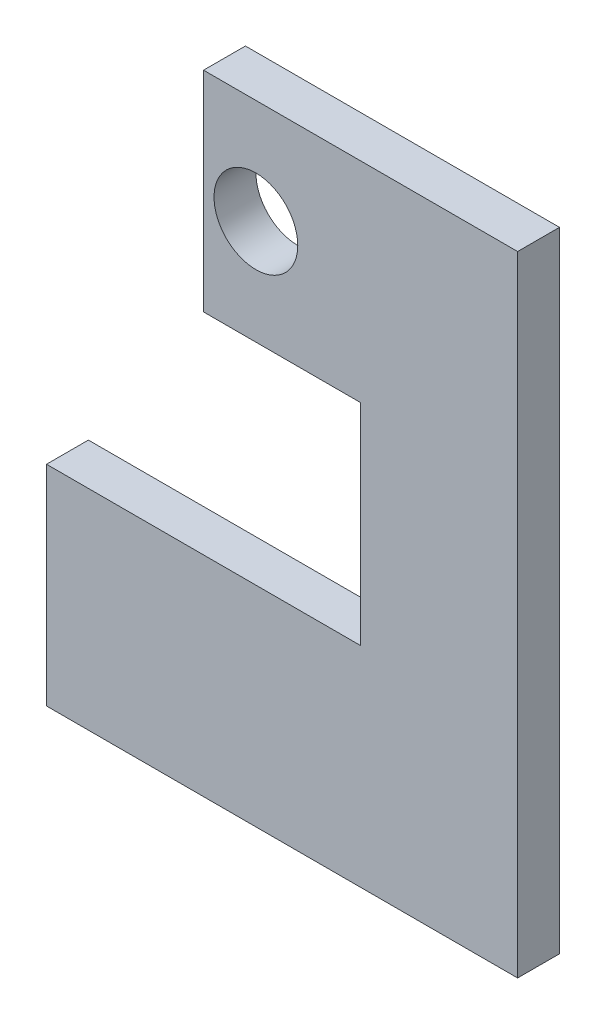
ISO-10303-21;
HEADER;
FILE_DESCRIPTION(('STEP AP214'),'2;1');
FILE_NAME('part.step','',(''),(''),'','','');
FILE_SCHEMA(('AUTOMOTIVE_DESIGN { 1 0 10303 214 1 1 1 1 }'));
ENDSEC;
DATA;
#1=APPLICATION_CONTEXT('core data for automotive mechanical design processes');
#2=APPLICATION_PROTOCOL_DEFINITION('international standard','automotive_design',2000,#1);
#3=PRODUCT_CONTEXT('',#1,'mechanical');
#4=PRODUCT('Part','Part','',(#3));
#5=PRODUCT_RELATED_PRODUCT_CATEGORY('part','',(#4));
#6=PRODUCT_DEFINITION_FORMATION('','',#4);
#7=PRODUCT_DEFINITION_CONTEXT('part definition',#1,'design');
#8=PRODUCT_DEFINITION('design','',#6,#7);
#9=PRODUCT_DEFINITION_SHAPE('','',#8);
#10=(LENGTH_UNIT() NAMED_UNIT(*) SI_UNIT(.MILLI.,.METRE.));
#11=(NAMED_UNIT(*) PLANE_ANGLE_UNIT() SI_UNIT($,.RADIAN.));
#12=(NAMED_UNIT(*) SI_UNIT($,.STERADIAN.) SOLID_ANGLE_UNIT());
#13=UNCERTAINTY_MEASURE_WITH_UNIT(LENGTH_MEASURE(1.E-05),#10,'distance_accuracy_value','');
#14=(GEOMETRIC_REPRESENTATION_CONTEXT(3) GLOBAL_UNCERTAINTY_ASSIGNED_CONTEXT((#13)) GLOBAL_UNIT_ASSIGNED_CONTEXT((#10,
#11,#12)) REPRESENTATION_CONTEXT('',''));
#15=CARTESIAN_POINT('',(0.,0.,0.));
#16=DIRECTION('',(0.,0.,1.));
#17=DIRECTION('',(1.,0.,0.));
#18=AXIS2_PLACEMENT_3D('',#15,#16,#17);
#19=CARTESIAN_POINT('',(0.,0.,20.));
#20=DIRECTION('',(0.,0.,1.));
#21=DIRECTION('',(1.,0.,0.));
#22=AXIS2_PLACEMENT_3D('',#19,#20,#21);
#23=PLANE('',#22);
#24=DIRECTION('',(0.,-1.,0.));
#25=VECTOR('',#24,1.);
#26=CARTESIAN_POINT('',(-75.,50.,20.));
#27=LINE('',#26,#25);
#28=CARTESIAN_POINT('',(-75.,50.,20.));
#29=VERTEX_POINT('',#28);
#30=CARTESIAN_POINT('',(-75.,-50.,20.));
#31=VERTEX_POINT('',#30);
#32=EDGE_CURVE('E166',#29,#31,#27,.T.);
#33=ORIENTED_EDGE('',*,*,#32,.T.);
#34=DIRECTION('',(1.,0.,0.));
#35=VECTOR('',#34,1.);
#36=CARTESIAN_POINT('',(-75.,-50.,20.));
#37=LINE('',#36,#35);
#38=CARTESIAN_POINT('',(0.,-50.,20.));
#39=VERTEX_POINT('',#38);
#40=EDGE_CURVE('E101',#31,#39,#37,.T.);
#41=ORIENTED_EDGE('',*,*,#40,.T.);
#42=DIRECTION('',(0.,-1.,0.));
#43=VECTOR('',#42,1.);
#44=CARTESIAN_POINT('',(0.,-50.,20.));
#45=LINE('',#44,#43);
#46=CARTESIAN_POINT('',(0.,-150.488405268232,20.));
#47=VERTEX_POINT('',#46);
#48=EDGE_CURVE('E187',#39,#47,#45,.T.);
#49=ORIENTED_EDGE('',*,*,#48,.T.);
#50=DIRECTION('',(-1.,0.,0.));
#51=VECTOR('',#50,1.);
#52=CARTESIAN_POINT('',(0.,-150.488405268232,20.));
#53=LINE('',#52,#51);
#54=CARTESIAN_POINT('',(-150.,-150.488405268232,20.));
#55=VERTEX_POINT('',#54);
#56=EDGE_CURVE('E201',#47,#55,#53,.T.);
#57=ORIENTED_EDGE('',*,*,#56,.T.);
#58=DIRECTION('',(0.,-1.,0.));
#59=VECTOR('',#58,1.);
#60=CARTESIAN_POINT('',(-150.,-150.488405268232,20.));
#61=LINE('',#60,#59);
#62=CARTESIAN_POINT('',(-150.,-250.488405268232,20.));
#63=VERTEX_POINT('',#62);
#64=EDGE_CURVE('E120',#55,#63,#61,.T.);
#65=ORIENTED_EDGE('',*,*,#64,.T.);
#66=DIRECTION('',(1.,0.,0.));
#67=VECTOR('',#66,1.);
#68=CARTESIAN_POINT('',(-150.,-250.488405268232,20.));
#69=LINE('',#68,#67);
#70=CARTESIAN_POINT('',(75.,-250.488405268232,20.));
#71=VERTEX_POINT('',#70);
#72=EDGE_CURVE('E114',#63,#71,#69,.T.);
#73=ORIENTED_EDGE('',*,*,#72,.T.);
#74=DIRECTION('',(0.,1.,0.));
#75=VECTOR('',#74,1.);
#76=CARTESIAN_POINT('',(75.,-250.488405268232,20.));
#77=LINE('',#76,#75);
#78=CARTESIAN_POINT('',(75.,50.,20.));
#79=VERTEX_POINT('',#78);
#80=EDGE_CURVE('E118',#71,#79,#77,.T.);
#81=ORIENTED_EDGE('',*,*,#80,.T.);
#82=DIRECTION('',(-1.,0.,0.));
#83=VECTOR('',#82,1.);
#84=CARTESIAN_POINT('',(-75.,50.,20.));
#85=LINE('',#84,#83);
#86=EDGE_CURVE('E59',#79,#29,#85,.T.);
#87=ORIENTED_EDGE('',*,*,#86,.T.);
#88=EDGE_LOOP('',(#33,#41,#49,#57,#65,#73,#81,#87));
#89=FACE_BOUND('',#88,.T.);
#90=CARTESIAN_POINT('',(-50.,0.,20.));
#91=DIRECTION('',(0.,0.,1.));
#92=DIRECTION('',(1.,0.,0.));
#93=AXIS2_PLACEMENT_3D('',#90,#91,#92);
#94=CIRCLE('',#93,20.);
#95=CARTESIAN_POINT('',(-30.,0.,20.));
#96=VERTEX_POINT('',#95);
#97=EDGE_CURVE('E148',#96,#96,#94,.T.);
#98=ORIENTED_EDGE('',*,*,#97,.F.);
#99=EDGE_LOOP('',(#98));
#100=FACE_BOUND('',#99,.T.);
#101=ADVANCED_FACE('F41',(#89,#100),#23,.T.);
#102=CARTESIAN_POINT('',(0.,0.,0.));
#103=DIRECTION('',(0.,0.,1.));
#104=DIRECTION('',(1.,0.,0.));
#105=AXIS2_PLACEMENT_3D('',#102,#103,#104);
#106=PLANE('',#105);
#107=DIRECTION('',(0.,-1.,0.));
#108=VECTOR('',#107,1.);
#109=CARTESIAN_POINT('',(-75.,50.,0.));
#110=LINE('',#109,#108);
#111=CARTESIAN_POINT('',(-75.,50.,0.));
#112=VERTEX_POINT('',#111);
#113=CARTESIAN_POINT('',(-75.,-50.,0.));
#114=VERTEX_POINT('',#113);
#115=EDGE_CURVE('E143',#112,#114,#110,.T.);
#116=ORIENTED_EDGE('',*,*,#115,.F.);
#117=DIRECTION('',(-1.,0.,0.));
#118=VECTOR('',#117,1.);
#119=CARTESIAN_POINT('',(-75.,50.,0.));
#120=LINE('',#119,#118);
#121=CARTESIAN_POINT('',(75.,50.,0.));
#122=VERTEX_POINT('',#121);
#123=EDGE_CURVE('E93',#122,#112,#120,.T.);
#124=ORIENTED_EDGE('',*,*,#123,.F.);
#125=DIRECTION('',(0.,1.,0.));
#126=VECTOR('',#125,1.);
#127=CARTESIAN_POINT('',(75.,50.,0.));
#128=LINE('',#127,#126);
#129=CARTESIAN_POINT('',(75.,-250.488405268232,0.));
#130=VERTEX_POINT('',#129);
#131=EDGE_CURVE('E87',#130,#122,#128,.T.);
#132=ORIENTED_EDGE('',*,*,#131,.F.);
#133=DIRECTION('',(1.,0.,0.));
#134=VECTOR('',#133,1.);
#135=CARTESIAN_POINT('',(-150.,-250.488405268232,0.));
#136=LINE('',#135,#134);
#137=CARTESIAN_POINT('',(-150.,-250.488405268232,0.));
#138=VERTEX_POINT('',#137);
#139=EDGE_CURVE('E130',#138,#130,#136,.T.);
#140=ORIENTED_EDGE('',*,*,#139,.F.);
#141=DIRECTION('',(0.,-1.,0.));
#142=VECTOR('',#141,1.);
#143=CARTESIAN_POINT('',(-150.,-150.488405268232,0.));
#144=LINE('',#143,#142);
#145=CARTESIAN_POINT('',(-150.,-150.488405268232,0.));
#146=VERTEX_POINT('',#145);
#147=EDGE_CURVE('E157',#146,#138,#144,.T.);
#148=ORIENTED_EDGE('',*,*,#147,.F.);
#149=DIRECTION('',(-1.,0.,0.));
#150=VECTOR('',#149,1.);
#151=CARTESIAN_POINT('',(0.,-150.488405268232,0.));
#152=LINE('',#151,#150);
#153=CARTESIAN_POINT('',(0.,-150.488405268232,0.));
#154=VERTEX_POINT('',#153);
#155=EDGE_CURVE('E154',#154,#146,#152,.T.);
#156=ORIENTED_EDGE('',*,*,#155,.F.);
#157=DIRECTION('',(0.,-1.,0.));
#158=VECTOR('',#157,1.);
#159=CARTESIAN_POINT('',(0.,-50.,0.));
#160=LINE('',#159,#158);
#161=CARTESIAN_POINT('',(0.,-50.,0.));
#162=VERTEX_POINT('',#161);
#163=EDGE_CURVE('E151',#162,#154,#160,.T.);
#164=ORIENTED_EDGE('',*,*,#163,.F.);
#165=DIRECTION('',(1.,0.,0.));
#166=VECTOR('',#165,1.);
#167=CARTESIAN_POINT('',(-75.,-50.,0.));
#168=LINE('',#167,#166);
#169=EDGE_CURVE('E147',#114,#162,#168,.T.);
#170=ORIENTED_EDGE('',*,*,#169,.F.);
#171=EDGE_LOOP('',(#116,#124,#132,#140,#148,#156,#164,#170));
#172=FACE_BOUND('',#171,.T.);
#173=CARTESIAN_POINT('',(-50.,0.,0.));
#174=DIRECTION('',(0.,0.,1.));
#175=DIRECTION('',(1.,0.,0.));
#176=AXIS2_PLACEMENT_3D('',#173,#174,#175);
#177=CIRCLE('',#176,20.);
#178=CARTESIAN_POINT('',(-30.,0.,0.));
#179=VERTEX_POINT('',#178);
#180=EDGE_CURVE('E211',#179,#179,#177,.T.);
#181=ORIENTED_EDGE('',*,*,#180,.T.);
#182=EDGE_LOOP('',(#181));
#183=FACE_BOUND('',#182,.T.);
#184=ADVANCED_FACE('F191',(#172,#183),#106,.F.);
#185=CARTESIAN_POINT('',(-75.,50.,20.));
#186=DIRECTION('',(1.,0.,0.));
#187=DIRECTION('',(0.,0.,-1.));
#188=AXIS2_PLACEMENT_3D('',#185,#186,#187);
#189=PLANE('',#188);
#190=ORIENTED_EDGE('',*,*,#115,.T.);
#191=DIRECTION('',(0.,0.,-1.));
#192=VECTOR('',#191,1.);
#193=CARTESIAN_POINT('',(-75.,-50.,20.));
#194=LINE('',#193,#192);
#195=EDGE_CURVE('E11',#31,#114,#194,.T.);
#196=ORIENTED_EDGE('',*,*,#195,.F.);
#197=ORIENTED_EDGE('',*,*,#32,.F.);
#198=DIRECTION('',(0.,0.,-1.));
#199=VECTOR('',#198,1.);
#200=CARTESIAN_POINT('',(-75.,50.,20.));
#201=LINE('',#200,#199);
#202=EDGE_CURVE('E139',#29,#112,#201,.T.);
#203=ORIENTED_EDGE('',*,*,#202,.T.);
#204=EDGE_LOOP('',(#190,#196,#197,#203));
#205=FACE_BOUND('',#204,.T.);
#206=ADVANCED_FACE('F43',(#205),#189,.F.);
#207=CARTESIAN_POINT('',(-75.,-50.,20.));
#208=DIRECTION('',(0.,1.,0.));
#209=DIRECTION('',(0.,0.,1.));
#210=AXIS2_PLACEMENT_3D('',#207,#208,#209);
#211=PLANE('',#210);
#212=ORIENTED_EDGE('',*,*,#169,.T.);
#213=DIRECTION('',(0.,0.,-1.));
#214=VECTOR('',#213,1.);
#215=CARTESIAN_POINT('',(0.,-50.,20.));
#216=LINE('',#215,#214);
#217=EDGE_CURVE('E51',#39,#162,#216,.T.);
#218=ORIENTED_EDGE('',*,*,#217,.F.);
#219=ORIENTED_EDGE('',*,*,#40,.F.);
#220=ORIENTED_EDGE('',*,*,#195,.T.);
#221=EDGE_LOOP('',(#212,#218,#219,#220));
#222=FACE_BOUND('',#221,.T.);
#223=ADVANCED_FACE('F241',(#222),#211,.F.);
#224=CARTESIAN_POINT('',(0.,-50.,20.));
#225=DIRECTION('',(1.,0.,0.));
#226=DIRECTION('',(0.,1.,0.));
#227=AXIS2_PLACEMENT_3D('',#224,#225,#226);
#228=PLANE('',#227);
#229=ORIENTED_EDGE('',*,*,#163,.T.);
#230=DIRECTION('',(0.,0.,-1.));
#231=VECTOR('',#230,1.);
#232=CARTESIAN_POINT('',(0.,-150.488405268232,20.));
#233=LINE('',#232,#231);
#234=EDGE_CURVE('E177',#47,#154,#233,.T.);
#235=ORIENTED_EDGE('',*,*,#234,.F.);
#236=ORIENTED_EDGE('',*,*,#48,.F.);
#237=ORIENTED_EDGE('',*,*,#217,.T.);
#238=EDGE_LOOP('',(#229,#235,#236,#237));
#239=FACE_BOUND('',#238,.T.);
#240=ADVANCED_FACE('F185',(#239),#228,.F.);
#241=CARTESIAN_POINT('',(0.,-150.488405268232,20.));
#242=DIRECTION('',(0.,-1.,0.));
#243=DIRECTION('',(1.,0.,0.));
#244=AXIS2_PLACEMENT_3D('',#241,#242,#243);
#245=PLANE('',#244);
#246=ORIENTED_EDGE('',*,*,#155,.T.);
#247=DIRECTION('',(0.,0.,-1.));
#248=VECTOR('',#247,1.);
#249=CARTESIAN_POINT('',(-150.,-150.488405268232,20.));
#250=LINE('',#249,#248);
#251=EDGE_CURVE('E173',#55,#146,#250,.T.);
#252=ORIENTED_EDGE('',*,*,#251,.F.);
#253=ORIENTED_EDGE('',*,*,#56,.F.);
#254=ORIENTED_EDGE('',*,*,#234,.T.);
#255=EDGE_LOOP('',(#246,#252,#253,#254));
#256=FACE_BOUND('',#255,.T.);
#257=ADVANCED_FACE('F196',(#256),#245,.F.);
#258=CARTESIAN_POINT('',(-150.,-150.488405268232,20.));
#259=DIRECTION('',(1.,0.,0.));
#260=DIRECTION('',(0.,1.,0.));
#261=AXIS2_PLACEMENT_3D('',#258,#259,#260);
#262=PLANE('',#261);
#263=ORIENTED_EDGE('',*,*,#147,.T.);
#264=DIRECTION('',(0.,0.,-1.));
#265=VECTOR('',#264,1.);
#266=CARTESIAN_POINT('',(-150.,-250.488405268232,20.));
#267=LINE('',#266,#265);
#268=EDGE_CURVE('E132',#63,#138,#267,.T.);
#269=ORIENTED_EDGE('',*,*,#268,.F.);
#270=ORIENTED_EDGE('',*,*,#64,.F.);
#271=ORIENTED_EDGE('',*,*,#251,.T.);
#272=EDGE_LOOP('',(#263,#269,#270,#271));
#273=FACE_BOUND('',#272,.T.);
#274=ADVANCED_FACE('F199',(#273),#262,.F.);
#275=CARTESIAN_POINT('',(-150.,-250.488405268232,20.));
#276=DIRECTION('',(0.,1.,0.));
#277=DIRECTION('',(0.,0.,1.));
#278=AXIS2_PLACEMENT_3D('',#275,#276,#277);
#279=PLANE('',#278);
#280=ORIENTED_EDGE('',*,*,#139,.T.);
#281=DIRECTION('',(0.,0.,-1.));
#282=VECTOR('',#281,1.);
#283=CARTESIAN_POINT('',(75.,-250.488405268232,20.));
#284=LINE('',#283,#282);
#285=EDGE_CURVE('E127',#71,#130,#284,.T.);
#286=ORIENTED_EDGE('',*,*,#285,.F.);
#287=ORIENTED_EDGE('',*,*,#72,.F.);
#288=ORIENTED_EDGE('',*,*,#268,.T.);
#289=EDGE_LOOP('',(#280,#286,#287,#288));
#290=FACE_BOUND('',#289,.T.);
#291=ADVANCED_FACE('F128',(#290),#279,.F.);
#292=CARTESIAN_POINT('',(75.,50.,20.));
#293=DIRECTION('',(-1.,0.,0.));
#294=DIRECTION('',(0.,0.,1.));
#295=AXIS2_PLACEMENT_3D('',#292,#293,#294);
#296=PLANE('',#295);
#297=ORIENTED_EDGE('',*,*,#131,.T.);
#298=DIRECTION('',(0.,0.,-1.));
#299=VECTOR('',#298,1.);
#300=CARTESIAN_POINT('',(75.,50.,20.));
#301=LINE('',#300,#299);
#302=EDGE_CURVE('E133',#79,#122,#301,.T.);
#303=ORIENTED_EDGE('',*,*,#302,.F.);
#304=ORIENTED_EDGE('',*,*,#80,.F.);
#305=ORIENTED_EDGE('',*,*,#285,.T.);
#306=EDGE_LOOP('',(#297,#303,#304,#305));
#307=FACE_BOUND('',#306,.T.);
#308=ADVANCED_FACE('F135',(#307),#296,.F.);
#309=CARTESIAN_POINT('',(-75.,50.,20.));
#310=DIRECTION('',(0.,-1.,0.));
#311=DIRECTION('',(0.,0.,-1.));
#312=AXIS2_PLACEMENT_3D('',#309,#310,#311);
#313=PLANE('',#312);
#314=ORIENTED_EDGE('',*,*,#123,.T.);
#315=ORIENTED_EDGE('',*,*,#202,.F.);
#316=ORIENTED_EDGE('',*,*,#86,.F.);
#317=ORIENTED_EDGE('',*,*,#302,.T.);
#318=EDGE_LOOP('',(#314,#315,#316,#317));
#319=FACE_BOUND('',#318,.T.);
#320=ADVANCED_FACE('F229',(#319),#313,.F.);
#321=CARTESIAN_POINT('',(-50.,0.,20.));
#322=DIRECTION('',(0.,0.,-1.));
#323=DIRECTION('',(-1.,0.,0.));
#324=AXIS2_PLACEMENT_3D('',#321,#322,#323);
#325=CYLINDRICAL_SURFACE('',#324,20.);
#326=ORIENTED_EDGE('',*,*,#97,.T.);
#327=EDGE_LOOP('',(#326));
#328=FACE_BOUND('',#327,.T.);
#329=ORIENTED_EDGE('',*,*,#180,.F.);
#330=EDGE_LOOP('',(#329));
#331=FACE_BOUND('',#330,.T.);
#332=ADVANCED_FACE('F219',(#328,#331),#325,.F.);
#333=CLOSED_SHELL('',(#101,#184,#206,#223,#240,#257,#274,#291,#308,#320,#332));
#334=MANIFOLD_SOLID_BREP('B2',#333);
#335=ADVANCED_BREP_SHAPE_REPRESENTATION('',(#18,#334),#14);
#336=SHAPE_DEFINITION_REPRESENTATION(#9,#335);
ENDSEC;
END-ISO-10303-21;
